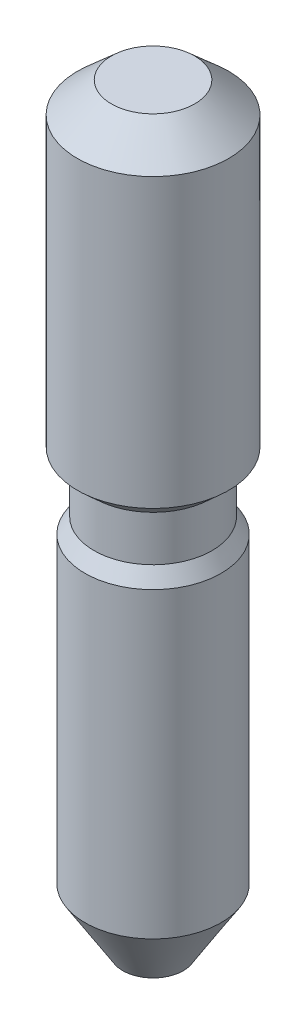
ISO-10303-21;
HEADER;
FILE_DESCRIPTION(('STEP AP214'),'2;1');
FILE_NAME('part.step','',(''),(''),'','','');
FILE_SCHEMA(('AUTOMOTIVE_DESIGN { 1 0 10303 214 1 1 1 1 }'));
ENDSEC;
DATA;
#1=APPLICATION_CONTEXT('core data for automotive mechanical design processes');
#2=APPLICATION_PROTOCOL_DEFINITION('international standard','automotive_design',2000,#1);
#3=PRODUCT_CONTEXT('',#1,'mechanical');
#4=PRODUCT('Part','Part','',(#3));
#5=PRODUCT_RELATED_PRODUCT_CATEGORY('part','',(#4));
#6=PRODUCT_DEFINITION_FORMATION('','',#4);
#7=PRODUCT_DEFINITION_CONTEXT('part definition',#1,'design');
#8=PRODUCT_DEFINITION('design','',#6,#7);
#9=PRODUCT_DEFINITION_SHAPE('','',#8);
#10=(LENGTH_UNIT() NAMED_UNIT(*) SI_UNIT(.MILLI.,.METRE.));
#11=(NAMED_UNIT(*) PLANE_ANGLE_UNIT() SI_UNIT($,.RADIAN.));
#12=(NAMED_UNIT(*) SI_UNIT($,.STERADIAN.) SOLID_ANGLE_UNIT());
#13=UNCERTAINTY_MEASURE_WITH_UNIT(LENGTH_MEASURE(1.E-05),#10,'distance_accuracy_value','');
#14=(GEOMETRIC_REPRESENTATION_CONTEXT(3) GLOBAL_UNCERTAINTY_ASSIGNED_CONTEXT((#13)) GLOBAL_UNIT_ASSIGNED_CONTEXT((#10,
#11,#12)) REPRESENTATION_CONTEXT('',''));
#15=CARTESIAN_POINT('',(0.,0.,0.));
#16=DIRECTION('',(0.,0.,1.));
#17=DIRECTION('',(1.,0.,0.));
#18=AXIS2_PLACEMENT_3D('',#15,#16,#17);
#19=CARTESIAN_POINT('',(0.,0.,0.));
#20=DIRECTION('',(0.,1.,0.));
#21=DIRECTION('',(0.,0.,1.));
#22=AXIS2_PLACEMENT_3D('',#19,#20,#21);
#23=PLANE('',#22);
#24=CARTESIAN_POINT('',(0.,0.,0.));
#25=DIRECTION('',(0.,-1.,0.));
#26=DIRECTION('',(0.,0.,-1.));
#27=AXIS2_PLACEMENT_3D('',#24,#25,#26);
#28=CIRCLE('',#27,2.75);
#29=CARTESIAN_POINT('',(0.,0.,-2.75));
#30=VERTEX_POINT('',#29);
#31=EDGE_CURVE('E10',#30,#30,#28,.T.);
#32=ORIENTED_EDGE('',*,*,#31,.F.);
#33=EDGE_LOOP('',(#32));
#34=FACE_BOUND('',#33,.T.);
#35=ADVANCED_FACE('F31',(#34),#23,.T.);
#36=CARTESIAN_POINT('',(0.,-2.,0.));
#37=DIRECTION('',(0.,-1.,0.));
#38=DIRECTION('',(0.,0.,-1.));
#39=AXIS2_PLACEMENT_3D('',#36,#37,#38);
#40=CONICAL_SURFACE('',#39,5.,0.844153986113171);
#41=ORIENTED_EDGE('',*,*,#31,.T.);
#42=EDGE_LOOP('',(#41));
#43=FACE_BOUND('',#42,.T.);
#44=CARTESIAN_POINT('',(0.,-2.,0.));
#45=DIRECTION('',(0.,-1.,0.));
#46=DIRECTION('',(0.,0.,-1.));
#47=AXIS2_PLACEMENT_3D('',#44,#45,#46);
#48=CIRCLE('',#47,5.);
#49=CARTESIAN_POINT('',(0.,-2.,-5.));
#50=VERTEX_POINT('',#49);
#51=EDGE_CURVE('E37',#50,#50,#48,.T.);
#52=ORIENTED_EDGE('',*,*,#51,.F.);
#53=EDGE_LOOP('',(#52));
#54=FACE_BOUND('',#53,.T.);
#55=ADVANCED_FACE('F79',(#43,#54),#40,.T.);
#56=CARTESIAN_POINT('',(0.,-54.,0.));
#57=DIRECTION('',(0.,-1.,0.));
#58=DIRECTION('',(0.,0.,-1.));
#59=AXIS2_PLACEMENT_3D('',#56,#57,#58);
#60=CYLINDRICAL_SURFACE('',#59,5.);
#61=ORIENTED_EDGE('',*,*,#51,.T.);
#62=EDGE_LOOP('',(#61));
#63=FACE_BOUND('',#62,.T.);
#64=CARTESIAN_POINT('',(0.,-21.,0.));
#65=DIRECTION('',(0.,-1.,0.));
#66=DIRECTION('',(0.,0.,-1.));
#67=AXIS2_PLACEMENT_3D('',#64,#65,#66);
#68=CIRCLE('',#67,5.);
#69=CARTESIAN_POINT('',(0.,-21.,-5.));
#70=VERTEX_POINT('',#69);
#71=EDGE_CURVE('E41',#70,#70,#68,.T.);
#72=ORIENTED_EDGE('',*,*,#71,.F.);
#73=EDGE_LOOP('',(#72));
#74=FACE_BOUND('',#73,.T.);
#75=ADVANCED_FACE('F84',(#63,#74),#60,.T.);
#76=CARTESIAN_POINT('',(0.,-22.,0.));
#77=DIRECTION('',(0.,1.,0.));
#78=DIRECTION('',(0.,0.,1.));
#79=AXIS2_PLACEMENT_3D('',#76,#77,#78);
#80=CONICAL_SURFACE('',#79,3.9,0.832981266674431);
#81=ORIENTED_EDGE('',*,*,#71,.T.);
#82=EDGE_LOOP('',(#81));
#83=FACE_BOUND('',#82,.T.);
#84=CARTESIAN_POINT('',(0.,-22.,0.));
#85=DIRECTION('',(0.,-1.,0.));
#86=DIRECTION('',(0.,0.,-1.));
#87=AXIS2_PLACEMENT_3D('',#84,#85,#86);
#88=CIRCLE('',#87,3.9);
#89=CARTESIAN_POINT('',(0.,-22.,-3.9));
#90=VERTEX_POINT('',#89);
#91=EDGE_CURVE('E45',#90,#90,#88,.T.);
#92=ORIENTED_EDGE('',*,*,#91,.F.);
#93=EDGE_LOOP('',(#92));
#94=FACE_BOUND('',#93,.T.);
#95=ADVANCED_FACE('F88',(#83,#94),#80,.T.);
#96=CARTESIAN_POINT('',(0.,-54.,0.));
#97=DIRECTION('',(0.,-1.,0.));
#98=DIRECTION('',(0.,0.,-1.));
#99=AXIS2_PLACEMENT_3D('',#96,#97,#98);
#100=CYLINDRICAL_SURFACE('',#99,3.9);
#101=ORIENTED_EDGE('',*,*,#91,.T.);
#102=EDGE_LOOP('',(#101));
#103=FACE_BOUND('',#102,.T.);
#104=CARTESIAN_POINT('',(0.,-25.,0.));
#105=DIRECTION('',(0.,-1.,0.));
#106=DIRECTION('',(0.,0.,-1.));
#107=AXIS2_PLACEMENT_3D('',#104,#105,#106);
#108=CIRCLE('',#107,3.9);
#109=CARTESIAN_POINT('',(0.,-25.,-3.9));
#110=VERTEX_POINT('',#109);
#111=EDGE_CURVE('E50',#110,#110,#108,.T.);
#112=ORIENTED_EDGE('',*,*,#111,.F.);
#113=EDGE_LOOP('',(#112));
#114=FACE_BOUND('',#113,.T.);
#115=ADVANCED_FACE('F94',(#103,#114),#100,.T.);
#116=CARTESIAN_POINT('',(0.,-26.,0.));
#117=DIRECTION('',(0.,-1.,0.));
#118=DIRECTION('',(0.,0.,-1.));
#119=AXIS2_PLACEMENT_3D('',#116,#117,#118);
#120=CONICAL_SURFACE('',#119,4.5,0.540419500270584);
#121=ORIENTED_EDGE('',*,*,#111,.T.);
#122=EDGE_LOOP('',(#121));
#123=FACE_BOUND('',#122,.T.);
#124=CARTESIAN_POINT('',(0.,-26.,0.));
#125=DIRECTION('',(0.,-1.,0.));
#126=DIRECTION('',(0.,0.,-1.));
#127=AXIS2_PLACEMENT_3D('',#124,#125,#126);
#128=CIRCLE('',#127,4.5);
#129=CARTESIAN_POINT('',(0.,-26.,-4.5));
#130=VERTEX_POINT('',#129);
#131=EDGE_CURVE('E53',#130,#130,#128,.T.);
#132=ORIENTED_EDGE('',*,*,#131,.F.);
#133=EDGE_LOOP('',(#132));
#134=FACE_BOUND('',#133,.T.);
#135=ADVANCED_FACE('F75',(#123,#134),#120,.T.);
#136=CARTESIAN_POINT('',(0.,-54.,0.));
#137=DIRECTION('',(0.,-1.,0.));
#138=DIRECTION('',(0.,0.,-1.));
#139=AXIS2_PLACEMENT_3D('',#136,#137,#138);
#140=CYLINDRICAL_SURFACE('',#139,4.5);
#141=ORIENTED_EDGE('',*,*,#131,.T.);
#142=EDGE_LOOP('',(#141));
#143=FACE_BOUND('',#142,.T.);
#144=CARTESIAN_POINT('',(0.,-46.,0.));
#145=DIRECTION('',(0.,-1.,0.));
#146=DIRECTION('',(0.,0.,-1.));
#147=AXIS2_PLACEMENT_3D('',#144,#145,#146);
#148=CIRCLE('',#147,4.5);
#149=CARTESIAN_POINT('',(0.,-46.,-4.5));
#150=VERTEX_POINT('',#149);
#151=EDGE_CURVE('E56',#150,#150,#148,.T.);
#152=ORIENTED_EDGE('',*,*,#151,.F.);
#153=EDGE_LOOP('',(#152));
#154=FACE_BOUND('',#153,.T.);
#155=ADVANCED_FACE('F67',(#143,#154),#140,.T.);
#156=CARTESIAN_POINT('',(0.,-50.,0.));
#157=DIRECTION('',(0.,1.,0.));
#158=DIRECTION('',(0.,0.,1.));
#159=AXIS2_PLACEMENT_3D('',#156,#157,#158);
#160=CONICAL_SURFACE('',#159,2.,0.558599315343562);
#161=ORIENTED_EDGE('',*,*,#151,.T.);
#162=EDGE_LOOP('',(#161));
#163=FACE_BOUND('',#162,.T.);
#164=CARTESIAN_POINT('',(0.,-50.,0.));
#165=DIRECTION('',(0.,-1.,0.));
#166=DIRECTION('',(0.,0.,-1.));
#167=AXIS2_PLACEMENT_3D('',#164,#165,#166);
#168=CIRCLE('',#167,2.);
#169=CARTESIAN_POINT('',(0.,-50.,-2.));
#170=VERTEX_POINT('',#169);
#171=EDGE_CURVE('E59',#170,#170,#168,.T.);
#172=ORIENTED_EDGE('',*,*,#171,.F.);
#173=EDGE_LOOP('',(#172));
#174=FACE_BOUND('',#173,.T.);
#175=ADVANCED_FACE('F65',(#163,#174),#160,.T.);
#176=CARTESIAN_POINT('',(2.,-50.,0.));
#177=DIRECTION('',(0.,-1.,0.));
#178=DIRECTION('',(0.,0.,-1.));
#179=AXIS2_PLACEMENT_3D('',#176,#177,#178);
#180=PLANE('',#179);
#181=ORIENTED_EDGE('',*,*,#171,.T.);
#182=EDGE_LOOP('',(#181));
#183=FACE_BOUND('',#182,.T.);
#184=ADVANCED_FACE('F63',(#183),#180,.T.);
#185=CLOSED_SHELL('',(#35,#55,#75,#95,#115,#135,#155,#175,#184));
#186=MANIFOLD_SOLID_BREP('B2',#185);
#187=ADVANCED_BREP_SHAPE_REPRESENTATION('',(#18,#186),#14);
#188=SHAPE_DEFINITION_REPRESENTATION(#9,#187);
ENDSEC;
END-ISO-10303-21;
